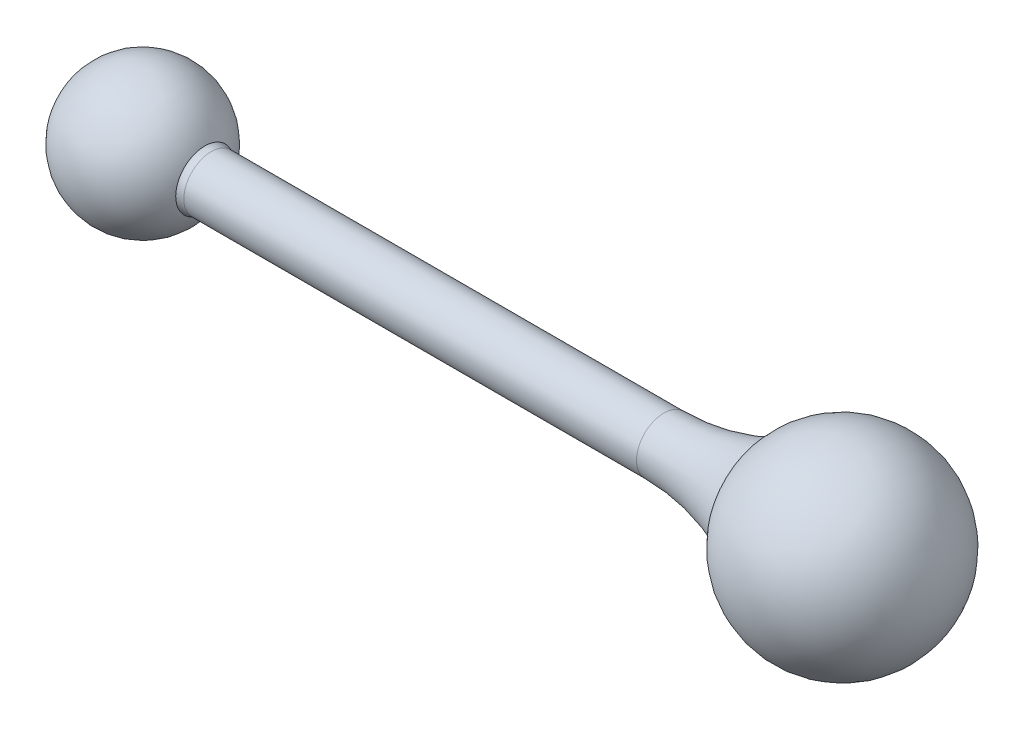
ISO-10303-21;
HEADER;
FILE_DESCRIPTION(('STEP AP214'),'2;1');
FILE_NAME('part.step','',(''),(''),'','','');
FILE_SCHEMA(('AUTOMOTIVE_DESIGN { 1 0 10303 214 1 1 1 1 }'));
ENDSEC;
DATA;
#1=APPLICATION_CONTEXT('core data for automotive mechanical design processes');
#2=APPLICATION_PROTOCOL_DEFINITION('international standard','automotive_design',2000,#1);
#3=PRODUCT_CONTEXT('',#1,'mechanical');
#4=PRODUCT('Part','Part','',(#3));
#5=PRODUCT_RELATED_PRODUCT_CATEGORY('part','',(#4));
#6=PRODUCT_DEFINITION_FORMATION('','',#4);
#7=PRODUCT_DEFINITION_CONTEXT('part definition',#1,'design');
#8=PRODUCT_DEFINITION('design','',#6,#7);
#9=PRODUCT_DEFINITION_SHAPE('','',#8);
#10=(LENGTH_UNIT() NAMED_UNIT(*) SI_UNIT(.MILLI.,.METRE.));
#11=(NAMED_UNIT(*) PLANE_ANGLE_UNIT() SI_UNIT($,.RADIAN.));
#12=(NAMED_UNIT(*) SI_UNIT($,.STERADIAN.) SOLID_ANGLE_UNIT());
#13=UNCERTAINTY_MEASURE_WITH_UNIT(LENGTH_MEASURE(1.E-05),#10,'distance_accuracy_value','');
#14=(GEOMETRIC_REPRESENTATION_CONTEXT(3) GLOBAL_UNCERTAINTY_ASSIGNED_CONTEXT((#13)) GLOBAL_UNIT_ASSIGNED_CONTEXT((#10,
#11,#12)) REPRESENTATION_CONTEXT('',''));
#15=CARTESIAN_POINT('',(0.,0.,0.));
#16=DIRECTION('',(0.,0.,1.));
#17=DIRECTION('',(1.,0.,0.));
#18=AXIS2_PLACEMENT_3D('',#15,#16,#17);
#19=CARTESIAN_POINT('',(-7.,0.,0.));
#20=DIRECTION('',(1.,0.,0.));
#21=DIRECTION('',(0.,-1.,0.));
#22=AXIS2_PLACEMENT_3D('',#19,#20,#21);
#23=SPHERICAL_SURFACE('',#22,7.);
#24=CARTESIAN_POINT('',(-13.0775343120244,0.,0.));
#25=DIRECTION('',(-1.,0.,0.));
#26=DIRECTION('',(0.,-1.,0.));
#27=AXIS2_PLACEMENT_3D('',#24,#25,#26);
#28=CIRCLE('',#27,3.47326599703594);
#29=CARTESIAN_POINT('',(-13.0775343120244,-3.47326599703594,0.));
#30=VERTEX_POINT('',#29);
#31=EDGE_CURVE('E10',#30,#30,#28,.T.);
#32=ORIENTED_EDGE('',*,*,#31,.F.);
#33=EDGE_LOOP('',(#32));
#34=FACE_BOUND('',#33,.T.);
#35=ADVANCED_FACE('F35',(#34),#23,.T.);
#36=CARTESIAN_POINT('',(-58.,0.,0.));
#37=DIRECTION('',(1.,0.,0.));
#38=DIRECTION('',(0.,-1.,0.));
#39=AXIS2_PLACEMENT_3D('',#36,#37,#38);
#40=SPHERICAL_SURFACE('',#39,5.);
#41=CARTESIAN_POINT('',(-53.4705882352941,0.,0.));
#42=DIRECTION('',(1.,0.,0.));
#43=DIRECTION('',(0.,1.,0.));
#44=AXIS2_PLACEMENT_3D('',#41,#42,#43);
#45=CIRCLE('',#44,2.11764705882354);
#46=CARTESIAN_POINT('',(-53.4705882352941,2.11764705882353,0.));
#47=VERTEX_POINT('',#46);
#48=EDGE_CURVE('E41',#47,#47,#45,.T.);
#49=ORIENTED_EDGE('',*,*,#48,.F.);
#50=EDGE_LOOP('',(#49));
#51=FACE_BOUND('',#50,.T.);
#52=ADVANCED_FACE('F65',(#51),#40,.T.);
#53=CARTESIAN_POINT('',(-53.,0.,0.));
#54=DIRECTION('',(1.,0.,0.));
#55=DIRECTION('',(0.,1.,0.));
#56=AXIS2_PLACEMENT_3D('',#53,#54,#55);
#57=TOROIDAL_SURFACE('',#56,3.,1.);
#58=CARTESIAN_POINT('',(-53.,0.,0.));
#59=DIRECTION('',(1.,0.,0.));
#60=DIRECTION('',(0.,1.,0.));
#61=AXIS2_PLACEMENT_3D('',#58,#59,#60);
#62=CIRCLE('',#61,2.);
#63=CARTESIAN_POINT('',(-53.,2.,0.));
#64=VERTEX_POINT('',#63);
#65=EDGE_CURVE('E45',#64,#64,#62,.T.);
#66=ORIENTED_EDGE('',*,*,#65,.F.);
#67=EDGE_LOOP('',(#66));
#68=FACE_BOUND('',#67,.T.);
#69=ORIENTED_EDGE('',*,*,#48,.T.);
#70=EDGE_LOOP('',(#69));
#71=FACE_BOUND('',#70,.T.);
#72=ADVANCED_FACE('F60',(#68,#71),#57,.F.);
#73=CARTESIAN_POINT('',(0.,0.,0.));
#74=DIRECTION('',(1.,0.,0.));
#75=DIRECTION('',(0.,1.,0.));
#76=AXIS2_PLACEMENT_3D('',#73,#74,#75);
#77=CYLINDRICAL_SURFACE('',#76,2.00000000000001);
#78=CARTESIAN_POINT('',(-20.,0.,0.));
#79=DIRECTION('',(1.,0.,0.));
#80=DIRECTION('',(0.,1.,0.));
#81=AXIS2_PLACEMENT_3D('',#78,#79,#80);
#82=CIRCLE('',#81,2.00000000000001);
#83=CARTESIAN_POINT('',(-20.,2.00000000000001,0.));
#84=VERTEX_POINT('',#83);
#85=EDGE_CURVE('E49',#84,#84,#82,.T.);
#86=ORIENTED_EDGE('',*,*,#85,.F.);
#87=EDGE_LOOP('',(#86));
#88=FACE_BOUND('',#87,.T.);
#89=ORIENTED_EDGE('',*,*,#65,.T.);
#90=EDGE_LOOP('',(#89));
#91=FACE_BOUND('',#90,.T.);
#92=ADVANCED_FACE('F57',(#88,#91),#77,.T.);
#93=CARTESIAN_POINT('',(-20.,0.,0.));
#94=DIRECTION('',(1.,0.,0.));
#95=DIRECTION('',(0.,1.,0.));
#96=AXIS2_PLACEMENT_3D('',#93,#94,#95);
#97=TOROIDAL_SURFACE('',#96,19.,17.);
#98=ORIENTED_EDGE('',*,*,#31,.T.);
#99=EDGE_LOOP('',(#98));
#100=FACE_BOUND('',#99,.T.);
#101=ORIENTED_EDGE('',*,*,#85,.T.);
#102=EDGE_LOOP('',(#101));
#103=FACE_BOUND('',#102,.T.);
#104=ADVANCED_FACE('F55',(#100,#103),#97,.F.);
#105=CLOSED_SHELL('',(#35,#52,#72,#92,#104));
#106=MANIFOLD_SOLID_BREP('B2',#105);
#107=ADVANCED_BREP_SHAPE_REPRESENTATION('',(#18,#106),#14);
#108=SHAPE_DEFINITION_REPRESENTATION(#9,#107);
ENDSEC;
END-ISO-10303-21;
